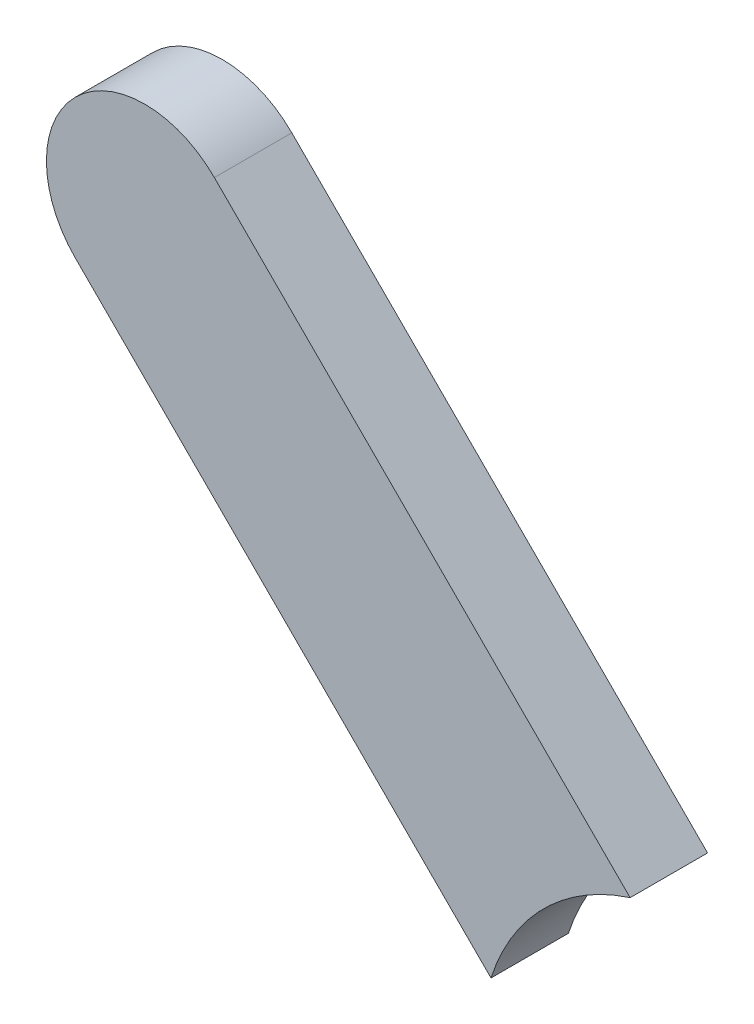
ISO-10303-21;
HEADER;
FILE_DESCRIPTION(('STEP AP214'),'2;1');
FILE_NAME('part.step','',(''),(''),'','','');
FILE_SCHEMA(('AUTOMOTIVE_DESIGN { 1 0 10303 214 1 1 1 1 }'));
ENDSEC;
DATA;
#1=APPLICATION_CONTEXT('core data for automotive mechanical design processes');
#2=APPLICATION_PROTOCOL_DEFINITION('international standard','automotive_design',2000,#1);
#3=PRODUCT_CONTEXT('',#1,'mechanical');
#4=PRODUCT('Part','Part','',(#3));
#5=PRODUCT_RELATED_PRODUCT_CATEGORY('part','',(#4));
#6=PRODUCT_DEFINITION_FORMATION('','',#4);
#7=PRODUCT_DEFINITION_CONTEXT('part definition',#1,'design');
#8=PRODUCT_DEFINITION('design','',#6,#7);
#9=PRODUCT_DEFINITION_SHAPE('','',#8);
#10=(LENGTH_UNIT() NAMED_UNIT(*) SI_UNIT(.MILLI.,.METRE.));
#11=(NAMED_UNIT(*) PLANE_ANGLE_UNIT() SI_UNIT($,.RADIAN.));
#12=(NAMED_UNIT(*) SI_UNIT($,.STERADIAN.) SOLID_ANGLE_UNIT());
#13=UNCERTAINTY_MEASURE_WITH_UNIT(LENGTH_MEASURE(1.E-05),#10,'distance_accuracy_value','');
#14=(GEOMETRIC_REPRESENTATION_CONTEXT(3) GLOBAL_UNCERTAINTY_ASSIGNED_CONTEXT((#13)) GLOBAL_UNIT_ASSIGNED_CONTEXT((#10,
#11,#12)) REPRESENTATION_CONTEXT('',''));
#15=CARTESIAN_POINT('',(0.,0.,0.));
#16=DIRECTION('',(0.,0.,1.));
#17=DIRECTION('',(1.,0.,0.));
#18=AXIS2_PLACEMENT_3D('',#15,#16,#17);
#19=CARTESIAN_POINT('',(92.25099406,69.31179686,0.));
#20=DIRECTION('',(0.707106781186548,0.707106781186548,0.));
#21=DIRECTION('',(0.707106781186548,-0.707106781186548,0.));
#22=AXIS2_PLACEMENT_3D('',#19,#20,#21);
#23=PLANE('',#22);
#24=DIRECTION('',(0.707106781186548,-0.707106781186548,0.));
#25=VECTOR('',#24,1.);
#26=CARTESIAN_POINT('',(92.25099406,69.31179686,0.1999996));
#27=LINE('',#26,#25);
#28=CARTESIAN_POINT('',(92.25099406,69.31179686,0.1999996));
#29=VERTEX_POINT('',#28);
#30=CARTESIAN_POINT('',(93.3244609788559,68.2383299411441,0.1999996));
#31=VERTEX_POINT('',#30);
#32=EDGE_CURVE('E11',#29,#31,#27,.T.);
#33=ORIENTED_EDGE('',*,*,#32,.F.);
#34=DIRECTION('',(0.,0.,1.));
#35=VECTOR('',#34,1.);
#36=CARTESIAN_POINT('',(92.25099406,69.31179686,0.));
#37=LINE('',#36,#35);
#38=CARTESIAN_POINT('',(92.25099406,69.31179686,0.));
#39=VERTEX_POINT('',#38);
#40=EDGE_CURVE('E24',#39,#29,#37,.T.);
#41=ORIENTED_EDGE('',*,*,#40,.F.);
#42=DIRECTION('',(0.707106781186548,-0.707106781186548,0.));
#43=VECTOR('',#42,1.);
#44=CARTESIAN_POINT('',(92.25099406,69.31179686,0.));
#45=LINE('',#44,#43);
#46=CARTESIAN_POINT('',(93.3244609788559,68.2383299411441,0.));
#47=VERTEX_POINT('',#46);
#48=EDGE_CURVE('E75',#39,#47,#45,.T.);
#49=ORIENTED_EDGE('',*,*,#48,.T.);
#50=DIRECTION('',(0.,0.,1.));
#51=VECTOR('',#50,1.);
#52=CARTESIAN_POINT('',(93.3244609788559,68.2383299411441,0.));
#53=LINE('',#52,#51);
#54=EDGE_CURVE('E37',#47,#31,#53,.T.);
#55=ORIENTED_EDGE('',*,*,#54,.T.);
#56=EDGE_LOOP('',(#33,#41,#49,#55));
#57=FACE_BOUND('',#56,.T.);
#58=ADVANCED_FACE('F17',(#57),#23,.F.);
#59=CARTESIAN_POINT('',(93.853,68.0690028,0.));
#60=DIRECTION('',(0.,0.,-1.));
#61=DIRECTION('',(1.,0.,0.));
#62=AXIS2_PLACEMENT_3D('',#59,#60,#61);
#63=CYLINDRICAL_SURFACE('',#62,0.55500016);
#64=DIRECTION('',(0.,0.,1.));
#65=VECTOR('',#64,1.);
#66=CARTESIAN_POINT('',(93.6836728588559,68.5975418211441,0.));
#67=LINE('',#66,#65);
#68=CARTESIAN_POINT('',(93.6836728588559,68.5975418211441,0.));
#69=VERTEX_POINT('',#68);
#70=CARTESIAN_POINT('',(93.6836728588559,68.5975418211441,0.1999996));
#71=VERTEX_POINT('',#70);
#72=EDGE_CURVE('E67',#69,#71,#67,.T.);
#73=ORIENTED_EDGE('',*,*,#72,.T.);
#74=CARTESIAN_POINT('',(93.853,68.0690028,0.1999996));
#75=DIRECTION('',(0.,0.,1.));
#76=DIRECTION('',(1.,0.,0.));
#77=AXIS2_PLACEMENT_3D('',#74,#75,#76);
#78=CIRCLE('',#77,0.55500016);
#79=EDGE_CURVE('E82',#71,#31,#78,.T.);
#80=ORIENTED_EDGE('',*,*,#79,.T.);
#81=ORIENTED_EDGE('',*,*,#54,.F.);
#82=CARTESIAN_POINT('',(93.853,68.0690028,0.));
#83=DIRECTION('',(0.,0.,1.));
#84=DIRECTION('',(1.,0.,0.));
#85=AXIS2_PLACEMENT_3D('',#82,#83,#84);
#86=CIRCLE('',#85,0.55500016);
#87=EDGE_CURVE('E80',#69,#47,#86,.T.);
#88=ORIENTED_EDGE('',*,*,#87,.F.);
#89=EDGE_LOOP('',(#73,#80,#81,#88));
#90=FACE_BOUND('',#89,.T.);
#91=ADVANCED_FACE('F88',(#90),#63,.F.);
#92=CARTESIAN_POINT('',(93.6836728588559,68.5975418211441,0.));
#93=DIRECTION('',(-0.707106781186544,-0.707106781186551,0.));
#94=DIRECTION('',(-0.707106781186551,0.707106781186544,0.));
#95=AXIS2_PLACEMENT_3D('',#92,#93,#94);
#96=PLANE('',#95);
#97=DIRECTION('',(-0.707106781186551,0.707106781186544,0.));
#98=VECTOR('',#97,1.);
#99=CARTESIAN_POINT('',(94.03260594,68.24860874,0.1999996));
#100=LINE('',#99,#98);
#101=CARTESIAN_POINT('',(92.61020594,69.67100874,0.1999996));
#102=VERTEX_POINT('',#101);
#103=EDGE_CURVE('E71',#71,#102,#100,.T.);
#104=ORIENTED_EDGE('',*,*,#103,.F.);
#105=ORIENTED_EDGE('',*,*,#72,.F.);
#106=DIRECTION('',(-0.707106781186551,0.707106781186544,0.));
#107=VECTOR('',#106,1.);
#108=CARTESIAN_POINT('',(94.03260594,68.24860874,0.));
#109=LINE('',#108,#107);
#110=CARTESIAN_POINT('',(92.61020594,69.67100874,0.));
#111=VERTEX_POINT('',#110);
#112=EDGE_CURVE('E63',#69,#111,#109,.T.);
#113=ORIENTED_EDGE('',*,*,#112,.T.);
#114=DIRECTION('',(0.,0.,1.));
#115=VECTOR('',#114,1.);
#116=CARTESIAN_POINT('',(92.61020594,69.67100874,0.));
#117=LINE('',#116,#115);
#118=EDGE_CURVE('E53',#111,#102,#117,.T.);
#119=ORIENTED_EDGE('',*,*,#118,.T.);
#120=EDGE_LOOP('',(#104,#105,#113,#119));
#121=FACE_BOUND('',#120,.T.);
#122=ADVANCED_FACE('F66',(#121),#96,.F.);
#123=CARTESIAN_POINT('',(92.4306,69.4914028,0.));
#124=DIRECTION('',(0.,0.,-1.));
#125=DIRECTION('',(0.707106781186548,0.707106781186548,0.));
#126=AXIS2_PLACEMENT_3D('',#123,#124,#125);
#127=CYLINDRICAL_SURFACE('',#126,0.254001156230761);
#128=CARTESIAN_POINT('',(92.4306,69.4914028,0.1999996));
#129=DIRECTION('',(0.,0.,1.));
#130=DIRECTION('',(0.707106781186548,0.707106781186548,0.));
#131=AXIS2_PLACEMENT_3D('',#128,#129,#130);
#132=CIRCLE('',#131,0.254001156230761);
#133=EDGE_CURVE('E59',#102,#29,#132,.T.);
#134=ORIENTED_EDGE('',*,*,#133,.F.);
#135=ORIENTED_EDGE('',*,*,#118,.F.);
#136=CARTESIAN_POINT('',(92.4306,69.4914028,0.));
#137=DIRECTION('',(0.,0.,1.));
#138=DIRECTION('',(0.707106781186548,0.707106781186548,0.));
#139=AXIS2_PLACEMENT_3D('',#136,#137,#138);
#140=CIRCLE('',#139,0.254001156230761);
#141=EDGE_CURVE('E57',#111,#39,#140,.T.);
#142=ORIENTED_EDGE('',*,*,#141,.T.);
#143=ORIENTED_EDGE('',*,*,#40,.T.);
#144=EDGE_LOOP('',(#134,#135,#142,#143));
#145=FACE_BOUND('',#144,.T.);
#146=ADVANCED_FACE('F55',(#145),#127,.T.);
#147=CARTESIAN_POINT('',(92.25099406,69.31179686,0.));
#148=DIRECTION('',(0.,0.,-1.));
#149=DIRECTION('',(-1.,0.,0.));
#150=AXIS2_PLACEMENT_3D('',#147,#148,#149);
#151=PLANE('',#150);
#152=ORIENTED_EDGE('',*,*,#48,.F.);
#153=ORIENTED_EDGE('',*,*,#141,.F.);
#154=ORIENTED_EDGE('',*,*,#112,.F.);
#155=ORIENTED_EDGE('',*,*,#87,.T.);
#156=EDGE_LOOP('',(#152,#153,#154,#155));
#157=FACE_BOUND('',#156,.T.);
#158=ADVANCED_FACE('F74',(#157),#151,.T.);
#159=CARTESIAN_POINT('',(92.25099406,69.31179686,0.1999996));
#160=DIRECTION('',(0.,0.,-1.));
#161=DIRECTION('',(-1.,0.,0.));
#162=AXIS2_PLACEMENT_3D('',#159,#160,#161);
#163=PLANE('',#162);
#164=ORIENTED_EDGE('',*,*,#133,.T.);
#165=ORIENTED_EDGE('',*,*,#32,.T.);
#166=ORIENTED_EDGE('',*,*,#79,.F.);
#167=ORIENTED_EDGE('',*,*,#103,.T.);
#168=EDGE_LOOP('',(#164,#165,#166,#167));
#169=FACE_BOUND('',#168,.T.);
#170=ADVANCED_FACE('F91',(#169),#163,.F.);
#171=CLOSED_SHELL('',(#58,#91,#122,#146,#158,#170));
#172=MANIFOLD_SOLID_BREP('B1',#171);
#173=ADVANCED_BREP_SHAPE_REPRESENTATION('',(#18,#172),#14);
#174=SHAPE_DEFINITION_REPRESENTATION(#9,#173);
ENDSEC;
END-ISO-10303-21;
